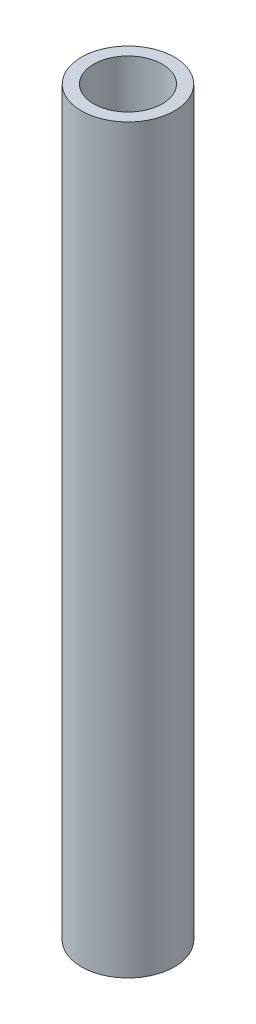
ISO-10303-21;
HEADER;
FILE_DESCRIPTION(('STEP AP214'),'2;1');
FILE_NAME('part.step','',(''),(''),'','','');
FILE_SCHEMA(('AUTOMOTIVE_DESIGN { 1 0 10303 214 1 1 1 1 }'));
ENDSEC;
DATA;
#1=APPLICATION_CONTEXT('core data for automotive mechanical design processes');
#2=APPLICATION_PROTOCOL_DEFINITION('international standard','automotive_design',2000,#1);
#3=PRODUCT_CONTEXT('',#1,'mechanical');
#4=PRODUCT('Part','Part','',(#3));
#5=PRODUCT_RELATED_PRODUCT_CATEGORY('part','',(#4));
#6=PRODUCT_DEFINITION_FORMATION('','',#4);
#7=PRODUCT_DEFINITION_CONTEXT('part definition',#1,'design');
#8=PRODUCT_DEFINITION('design','',#6,#7);
#9=PRODUCT_DEFINITION_SHAPE('','',#8);
#10=(LENGTH_UNIT() NAMED_UNIT(*) SI_UNIT(.MILLI.,.METRE.));
#11=(NAMED_UNIT(*) PLANE_ANGLE_UNIT() SI_UNIT($,.RADIAN.));
#12=(NAMED_UNIT(*) SI_UNIT($,.STERADIAN.) SOLID_ANGLE_UNIT());
#13=UNCERTAINTY_MEASURE_WITH_UNIT(LENGTH_MEASURE(1.E-05),#10,'distance_accuracy_value','');
#14=(GEOMETRIC_REPRESENTATION_CONTEXT(3) GLOBAL_UNCERTAINTY_ASSIGNED_CONTEXT((#13)) GLOBAL_UNIT_ASSIGNED_CONTEXT((#10,
#11,#12)) REPRESENTATION_CONTEXT('',''));
#15=CARTESIAN_POINT('',(0.,0.,0.));
#16=DIRECTION('',(0.,0.,1.));
#17=DIRECTION('',(1.,0.,0.));
#18=AXIS2_PLACEMENT_3D('',#15,#16,#17);
#19=CARTESIAN_POINT('',(0.,75.6412,0.));
#20=DIRECTION('',(0.,1.,0.));
#21=DIRECTION('',(0.,0.,1.));
#22=AXIS2_PLACEMENT_3D('',#19,#20,#21);
#23=PLANE('',#22);
#24=CARTESIAN_POINT('',(0.,75.6412,0.));
#25=DIRECTION('',(0.,1.,0.));
#26=DIRECTION('',(0.,0.,1.));
#27=AXIS2_PLACEMENT_3D('',#24,#25,#26);
#28=CIRCLE('',#27,4.7498);
#29=CARTESIAN_POINT('',(0.,75.6412,4.7498));
#30=VERTEX_POINT('',#29);
#31=EDGE_CURVE('E10',#30,#30,#28,.T.);
#32=ORIENTED_EDGE('',*,*,#31,.T.);
#33=EDGE_LOOP('',(#32));
#34=FACE_BOUND('',#33,.T.);
#35=CARTESIAN_POINT('',(0.,75.6412,0.));
#36=DIRECTION('',(0.,1.,0.));
#37=DIRECTION('',(0.,0.,1.));
#38=AXIS2_PLACEMENT_3D('',#35,#36,#37);
#39=CIRCLE('',#38,3.5052);
#40=CARTESIAN_POINT('',(0.,75.6412,3.5052));
#41=VERTEX_POINT('',#40);
#42=EDGE_CURVE('E44',#41,#41,#39,.T.);
#43=ORIENTED_EDGE('',*,*,#42,.F.);
#44=EDGE_LOOP('',(#43));
#45=FACE_BOUND('',#44,.T.);
#46=ADVANCED_FACE('F33',(#34,#45),#23,.T.);
#47=CARTESIAN_POINT('',(0.,0.,0.));
#48=DIRECTION('',(0.,1.,0.));
#49=DIRECTION('',(0.,0.,1.));
#50=AXIS2_PLACEMENT_3D('',#47,#48,#49);
#51=PLANE('',#50);
#52=CARTESIAN_POINT('',(0.,0.,0.));
#53=DIRECTION('',(0.,1.,0.));
#54=DIRECTION('',(0.,0.,1.));
#55=AXIS2_PLACEMENT_3D('',#52,#53,#54);
#56=CIRCLE('',#55,4.7498);
#57=CARTESIAN_POINT('',(0.,0.,4.7498));
#58=VERTEX_POINT('',#57);
#59=EDGE_CURVE('E37',#58,#58,#56,.T.);
#60=ORIENTED_EDGE('',*,*,#59,.F.);
#61=EDGE_LOOP('',(#60));
#62=FACE_BOUND('',#61,.T.);
#63=CARTESIAN_POINT('',(0.,0.,0.));
#64=DIRECTION('',(0.,1.,0.));
#65=DIRECTION('',(0.,0.,1.));
#66=AXIS2_PLACEMENT_3D('',#63,#64,#65);
#67=CIRCLE('',#66,3.5052);
#68=CARTESIAN_POINT('',(0.,0.,3.5052));
#69=VERTEX_POINT('',#68);
#70=EDGE_CURVE('E46',#69,#69,#67,.T.);
#71=ORIENTED_EDGE('',*,*,#70,.T.);
#72=EDGE_LOOP('',(#71));
#73=FACE_BOUND('',#72,.T.);
#74=ADVANCED_FACE('F56',(#62,#73),#51,.F.);
#75=CARTESIAN_POINT('',(0.,75.6412,0.));
#76=DIRECTION('',(0.,-1.,0.));
#77=DIRECTION('',(0.,0.,-1.));
#78=AXIS2_PLACEMENT_3D('',#75,#76,#77);
#79=CYLINDRICAL_SURFACE('',#78,4.7498);
#80=ORIENTED_EDGE('',*,*,#31,.F.);
#81=EDGE_LOOP('',(#80));
#82=FACE_BOUND('',#81,.T.);
#83=ORIENTED_EDGE('',*,*,#59,.T.);
#84=EDGE_LOOP('',(#83));
#85=FACE_BOUND('',#84,.T.);
#86=ADVANCED_FACE('F35',(#82,#85),#79,.T.);
#87=CARTESIAN_POINT('',(0.,75.6412,0.));
#88=DIRECTION('',(0.,-1.,0.));
#89=DIRECTION('',(0.,0.,-1.));
#90=AXIS2_PLACEMENT_3D('',#87,#88,#89);
#91=CYLINDRICAL_SURFACE('',#90,3.5052);
#92=ORIENTED_EDGE('',*,*,#42,.T.);
#93=EDGE_LOOP('',(#92));
#94=FACE_BOUND('',#93,.T.);
#95=ORIENTED_EDGE('',*,*,#70,.F.);
#96=EDGE_LOOP('',(#95));
#97=FACE_BOUND('',#96,.T.);
#98=ADVANCED_FACE('F52',(#94,#97),#91,.F.);
#99=CLOSED_SHELL('',(#46,#74,#86,#98));
#100=MANIFOLD_SOLID_BREP('B2',#99);
#101=ADVANCED_BREP_SHAPE_REPRESENTATION('',(#18,#100),#14);
#102=SHAPE_DEFINITION_REPRESENTATION(#9,#101);
ENDSEC;
END-ISO-10303-21;
